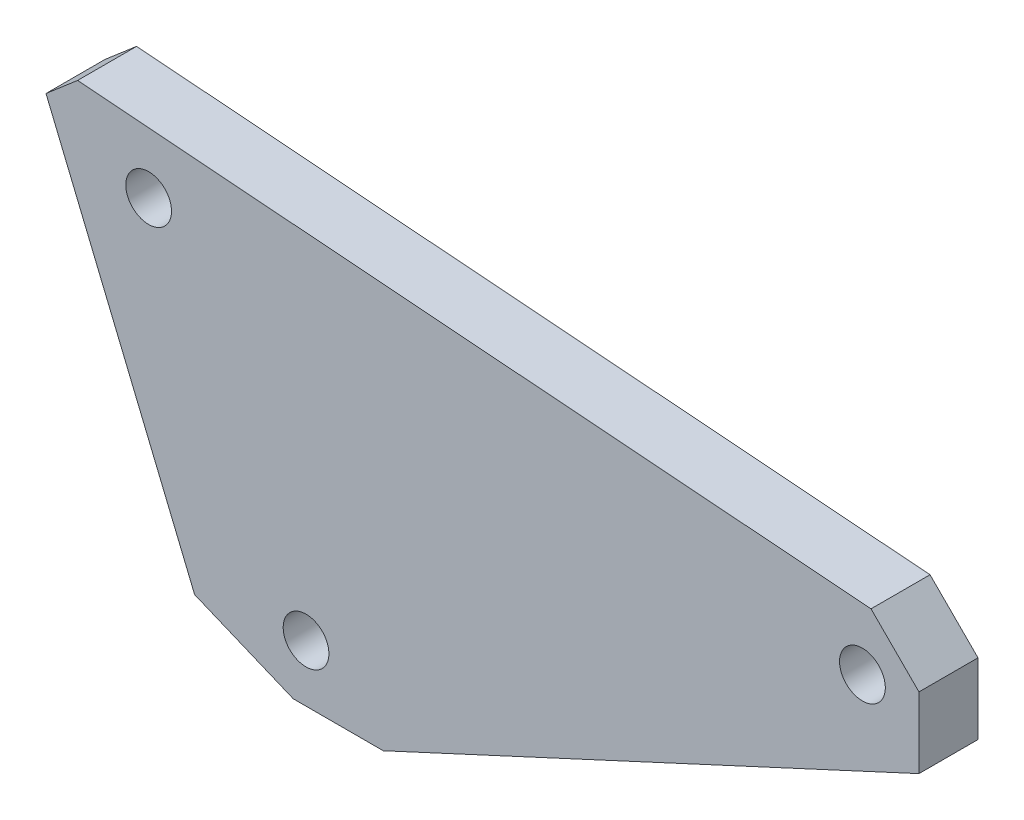
ISO-10303-21;
HEADER;
FILE_DESCRIPTION(('STEP AP214'),'2;1');
FILE_NAME('part.step','',(''),(''),'','','');
FILE_SCHEMA(('AUTOMOTIVE_DESIGN { 1 0 10303 214 1 1 1 1 }'));
ENDSEC;
DATA;
#1=APPLICATION_CONTEXT('core data for automotive mechanical design processes');
#2=APPLICATION_PROTOCOL_DEFINITION('international standard','automotive_design',2000,#1);
#3=PRODUCT_CONTEXT('',#1,'mechanical');
#4=PRODUCT('Part','Part','',(#3));
#5=PRODUCT_RELATED_PRODUCT_CATEGORY('part','',(#4));
#6=PRODUCT_DEFINITION_FORMATION('','',#4);
#7=PRODUCT_DEFINITION_CONTEXT('part definition',#1,'design');
#8=PRODUCT_DEFINITION('design','',#6,#7);
#9=PRODUCT_DEFINITION_SHAPE('','',#8);
#10=(LENGTH_UNIT() NAMED_UNIT(*) SI_UNIT(.MILLI.,.METRE.));
#11=(NAMED_UNIT(*) PLANE_ANGLE_UNIT() SI_UNIT($,.RADIAN.));
#12=(NAMED_UNIT(*) SI_UNIT($,.STERADIAN.) SOLID_ANGLE_UNIT());
#13=UNCERTAINTY_MEASURE_WITH_UNIT(LENGTH_MEASURE(1.E-05),#10,'distance_accuracy_value','');
#14=(GEOMETRIC_REPRESENTATION_CONTEXT(3) GLOBAL_UNCERTAINTY_ASSIGNED_CONTEXT((#13)) GLOBAL_UNIT_ASSIGNED_CONTEXT((#10,
#11,#12)) REPRESENTATION_CONTEXT('',''));
#15=CARTESIAN_POINT('',(0.,0.,0.));
#16=DIRECTION('',(0.,0.,1.));
#17=DIRECTION('',(1.,0.,0.));
#18=AXIS2_PLACEMENT_3D('',#15,#16,#17);
#19=CARTESIAN_POINT('',(40.3052811592435,9.5225496968505,4.));
#20=DIRECTION('',(-0.0764865575089781,-0.997070612604958,0.));
#21=DIRECTION('',(0.997070612604958,-0.0764865575089781,0.));
#22=AXIS2_PLACEMENT_3D('',#19,#20,#21);
#23=PLANE('',#22);
#24=DIRECTION('',(-0.997070612604958,0.0764865575089781,0.));
#25=VECTOR('',#24,1.);
#26=CARTESIAN_POINT('',(40.3052811592435,9.5225496968505,4.));
#27=LINE('',#26,#25);
#28=CARTESIAN_POINT('',(37.0560267090314,9.77180414706256,4.));
#29=VERTEX_POINT('',#28);
#30=CARTESIAN_POINT('',(-16.7035070029416,13.8957664973057,4.));
#31=VERTEX_POINT('',#30);
#32=EDGE_CURVE('E143',#29,#31,#27,.T.);
#33=ORIENTED_EDGE('',*,*,#32,.F.);
#34=DIRECTION('',(0.,0.,-1.));
#35=VECTOR('',#34,1.);
#36=CARTESIAN_POINT('',(37.0560267090314,9.77180414706256,4.));
#37=LINE('',#36,#35);
#38=CARTESIAN_POINT('',(37.0560267090314,9.77180414706256,0.));
#39=VERTEX_POINT('',#38);
#40=EDGE_CURVE('E43',#29,#39,#37,.T.);
#41=ORIENTED_EDGE('',*,*,#40,.T.);
#42=DIRECTION('',(-0.997070612604958,0.0764865575089781,0.));
#43=VECTOR('',#42,1.);
#44=CARTESIAN_POINT('',(40.3052811592435,9.5225496968505,0.));
#45=LINE('',#44,#43);
#46=CARTESIAN_POINT('',(-16.7035070029416,13.8957664973057,0.));
#47=VERTEX_POINT('',#46);
#48=EDGE_CURVE('E132',#39,#47,#45,.T.);
#49=ORIENTED_EDGE('',*,*,#48,.T.);
#50=DIRECTION('',(0.,0.,1.));
#51=VECTOR('',#50,1.);
#52=CARTESIAN_POINT('',(-16.7035070029416,13.8957664973057,4.));
#53=LINE('',#52,#51);
#54=EDGE_CURVE('E56',#47,#31,#53,.T.);
#55=ORIENTED_EDGE('',*,*,#54,.T.);
#56=EDGE_LOOP('',(#33,#41,#49,#55));
#57=FACE_BOUND('',#56,.T.);
#58=ADVANCED_FACE('F34',(#57),#23,.F.);
#59=CARTESIAN_POINT('',(-19.6947188407565,14.1252261698326,4.));
#60=DIRECTION('',(0.924192585062523,0.381926780568542,0.));
#61=DIRECTION('',(-0.381926780568541,0.924192585062523,0.));
#62=AXIS2_PLACEMENT_3D('',#59,#60,#61);
#63=PLANE('',#62);
#64=DIRECTION('',(0.381926780568542,-0.924192585062523,0.));
#65=VECTOR('',#64,1.);
#66=CARTESIAN_POINT('',(-19.6947188407565,14.1252261698326,0.));
#67=LINE('',#66,#65);
#68=CARTESIAN_POINT('',(-18.8420573324222,12.0619420963834,0.));
#69=VERTEX_POINT('',#68);
#70=CARTESIAN_POINT('',(-8.77118291816496,-12.3077222798545,0.));
#71=VERTEX_POINT('',#70);
#72=EDGE_CURVE('E134',#69,#71,#67,.T.);
#73=ORIENTED_EDGE('',*,*,#72,.T.);
#74=DIRECTION('',(0.,0.,1.));
#75=VECTOR('',#74,1.);
#76=CARTESIAN_POINT('',(-8.77118291816496,-12.3077222798545,4.));
#77=LINE('',#76,#75);
#78=CARTESIAN_POINT('',(-8.77118291816496,-12.3077222798545,4.));
#79=VERTEX_POINT('',#78);
#80=EDGE_CURVE('E166',#71,#79,#77,.T.);
#81=ORIENTED_EDGE('',*,*,#80,.T.);
#82=DIRECTION('',(0.381926780568542,-0.924192585062523,0.));
#83=VECTOR('',#82,1.);
#84=CARTESIAN_POINT('',(-19.6947188407565,14.1252261698326,4.));
#85=LINE('',#84,#83);
#86=CARTESIAN_POINT('',(-18.8420573324222,12.0619420963834,4.));
#87=VERTEX_POINT('',#86);
#88=EDGE_CURVE('E113',#87,#79,#85,.T.);
#89=ORIENTED_EDGE('',*,*,#88,.F.);
#90=DIRECTION('',(0.,0.,-1.));
#91=VECTOR('',#90,1.);
#92=CARTESIAN_POINT('',(-18.8420573324222,12.0619420963834,4.));
#93=LINE('',#92,#91);
#94=EDGE_CURVE('E163',#87,#69,#93,.T.);
#95=ORIENTED_EDGE('',*,*,#94,.T.);
#96=EDGE_LOOP('',(#73,#81,#89,#95));
#97=FACE_BOUND('',#96,.T.);
#98=ADVANCED_FACE('F187',(#97),#63,.F.);
#99=CARTESIAN_POINT('',(-7.62540257645933,-15.0803000350421,4.));
#100=DIRECTION('',(0.,1.,0.));
#101=DIRECTION('',(0.,0.,1.));
#102=AXIS2_PLACEMENT_3D('',#99,#100,#101);
#103=PLANE('',#102);
#104=DIRECTION('',(1.,0.,0.));
#105=VECTOR('',#104,1.);
#106=CARTESIAN_POINT('',(-7.62540257645933,-15.0803000350421,4.));
#107=LINE('',#106,#105);
#108=CARTESIAN_POINT('',(-2.09306036506088,-15.0803000350421,4.));
#109=VERTEX_POINT('',#108);
#110=CARTESIAN_POINT('',(4.00730701361784,-15.0803000350421,4.));
#111=VERTEX_POINT('',#110);
#112=EDGE_CURVE('E101',#109,#111,#107,.T.);
#113=ORIENTED_EDGE('',*,*,#112,.F.);
#114=DIRECTION('',(0.,0.,-1.));
#115=VECTOR('',#114,1.);
#116=CARTESIAN_POINT('',(-2.09306036506088,-15.0803000350421,4.));
#117=LINE('',#116,#115);
#118=CARTESIAN_POINT('',(-2.09306036506088,-15.0803000350421,0.));
#119=VERTEX_POINT('',#118);
#120=EDGE_CURVE('E122',#109,#119,#117,.T.);
#121=ORIENTED_EDGE('',*,*,#120,.T.);
#122=DIRECTION('',(1.,0.,0.));
#123=VECTOR('',#122,1.);
#124=CARTESIAN_POINT('',(-7.62540257645933,-15.0803000350421,0.));
#125=LINE('',#124,#123);
#126=CARTESIAN_POINT('',(4.00730701361784,-15.0803000350421,0.));
#127=VERTEX_POINT('',#126);
#128=EDGE_CURVE('E119',#119,#127,#125,.T.);
#129=ORIENTED_EDGE('',*,*,#128,.T.);
#130=DIRECTION('',(0.,0.,-1.));
#131=VECTOR('',#130,1.);
#132=CARTESIAN_POINT('',(4.00730701361784,-15.0803000350421,4.));
#133=LINE('',#132,#131);
#134=EDGE_CURVE('E116',#111,#127,#133,.T.);
#135=ORIENTED_EDGE('',*,*,#134,.F.);
#136=EDGE_LOOP('',(#113,#121,#129,#135));
#137=FACE_BOUND('',#136,.T.);
#138=ADVANCED_FACE('F117',(#137),#103,.F.);
#139=CARTESIAN_POINT('',(4.00730701361784,-15.0803000350421,4.));
#140=DIRECTION('',(-0.42016148154868,0.907449353640641,0.));
#141=DIRECTION('',(-0.907449353640641,-0.42016148154868,0.));
#142=AXIS2_PLACEMENT_3D('',#139,#140,#141);
#143=PLANE('',#142);
#144=DIRECTION('',(0.907449353640641,0.42016148154868,0.));
#145=VECTOR('',#144,1.);
#146=CARTESIAN_POINT('',(4.00730701361784,-15.0803000350421,0.));
#147=LINE('',#146,#145);
#148=CARTESIAN_POINT('',(40.3052811592435,1.72615922690515,0.));
#149=VERTEX_POINT('',#148);
#150=EDGE_CURVE('E139',#127,#149,#147,.T.);
#151=ORIENTED_EDGE('',*,*,#150,.T.);
#152=DIRECTION('',(0.,0.,-1.));
#153=VECTOR('',#152,1.);
#154=CARTESIAN_POINT('',(40.3052811592435,1.72615922690515,4.));
#155=LINE('',#154,#153);
#156=CARTESIAN_POINT('',(40.3052811592435,1.72615922690515,4.));
#157=VERTEX_POINT('',#156);
#158=EDGE_CURVE('E123',#157,#149,#155,.T.);
#159=ORIENTED_EDGE('',*,*,#158,.F.);
#160=DIRECTION('',(0.907449353640641,0.42016148154868,0.));
#161=VECTOR('',#160,1.);
#162=CARTESIAN_POINT('',(4.00730701361784,-15.0803000350421,4.));
#163=LINE('',#162,#161);
#164=EDGE_CURVE('E106',#111,#157,#163,.T.);
#165=ORIENTED_EDGE('',*,*,#164,.F.);
#166=ORIENTED_EDGE('',*,*,#134,.T.);
#167=EDGE_LOOP('',(#151,#159,#165,#166));
#168=FACE_BOUND('',#167,.T.);
#169=ADVANCED_FACE('F125',(#168),#143,.F.);
#170=CARTESIAN_POINT('',(40.3052811592435,1.72615922690515,4.));
#171=DIRECTION('',(-1.,0.,0.));
#172=DIRECTION('',(0.,0.,1.));
#173=AXIS2_PLACEMENT_3D('',#170,#171,#172);
#174=PLANE('',#173);
#175=DIRECTION('',(0.,1.,0.));
#176=VECTOR('',#175,1.);
#177=CARTESIAN_POINT('',(40.3052811592435,1.72615922690515,0.));
#178=LINE('',#177,#176);
#179=CARTESIAN_POINT('',(40.3052811592435,6.52254969685048,0.));
#180=VERTEX_POINT('',#179);
#181=EDGE_CURVE('E141',#149,#180,#178,.T.);
#182=ORIENTED_EDGE('',*,*,#181,.T.);
#183=DIRECTION('',(0.,0.,1.));
#184=VECTOR('',#183,1.);
#185=CARTESIAN_POINT('',(40.3052811592435,6.52254969685048,4.));
#186=LINE('',#185,#184);
#187=CARTESIAN_POINT('',(40.3052811592435,6.52254969685048,4.));
#188=VERTEX_POINT('',#187);
#189=EDGE_CURVE('E11',#180,#188,#186,.T.);
#190=ORIENTED_EDGE('',*,*,#189,.T.);
#191=DIRECTION('',(0.,1.,0.));
#192=VECTOR('',#191,1.);
#193=CARTESIAN_POINT('',(40.3052811592435,1.72615922690515,4.));
#194=LINE('',#193,#192);
#195=EDGE_CURVE('E127',#157,#188,#194,.T.);
#196=ORIENTED_EDGE('',*,*,#195,.F.);
#197=ORIENTED_EDGE('',*,*,#158,.T.);
#198=EDGE_LOOP('',(#182,#190,#196,#197));
#199=FACE_BOUND('',#198,.T.);
#200=ADVANCED_FACE('F201',(#199),#174,.F.);
#201=CARTESIAN_POINT('',(0.,0.,4.));
#202=DIRECTION('',(0.,0.,-1.));
#203=DIRECTION('',(-1.,0.,0.));
#204=AXIS2_PLACEMENT_3D('',#201,#202,#203);
#205=PLANE('',#204);
#206=CARTESIAN_POINT('',(-11.8877500790562,9.40291745557331,4.));
#207=DIRECTION('',(0.,0.,-1.));
#208=DIRECTION('',(-1.,0.,0.));
#209=AXIS2_PLACEMENT_3D('',#206,#207,#208);
#210=CIRCLE('',#209,1.55);
#211=CARTESIAN_POINT('',(-13.4377500790562,9.40291745557331,4.));
#212=VERTEX_POINT('',#211);
#213=EDGE_CURVE('E135',#212,#212,#210,.F.);
#214=ORIENTED_EDGE('',*,*,#213,.F.);
#215=EDGE_LOOP('',(#214));
#216=FACE_BOUND('',#215,.T.);
#217=CARTESIAN_POINT('',(-1.22267549855487,-11.2287016488662,4.));
#218=DIRECTION('',(0.,0.,-1.));
#219=DIRECTION('',(-1.,0.,0.));
#220=AXIS2_PLACEMENT_3D('',#217,#218,#219);
#221=CIRCLE('',#220,1.55);
#222=CARTESIAN_POINT('',(-2.77267549855487,-11.2287016488662,4.));
#223=VERTEX_POINT('',#222);
#224=EDGE_CURVE('E152',#223,#223,#221,.F.);
#225=ORIENTED_EDGE('',*,*,#224,.F.);
#226=EDGE_LOOP('',(#225));
#227=FACE_BOUND('',#226,.T.);
#228=CARTESIAN_POINT('',(36.4749180601786,5.62435446187783,4.));
#229=DIRECTION('',(0.,0.,-1.));
#230=DIRECTION('',(-1.,0.,0.));
#231=AXIS2_PLACEMENT_3D('',#228,#229,#230);
#232=CIRCLE('',#231,1.55);
#233=CARTESIAN_POINT('',(34.9249180601785,5.62435446187783,4.));
#234=VERTEX_POINT('',#233);
#235=EDGE_CURVE('E148',#234,#234,#232,.F.);
#236=ORIENTED_EDGE('',*,*,#235,.F.);
#237=EDGE_LOOP('',(#236));
#238=FACE_BOUND('',#237,.T.);
#239=ORIENTED_EDGE('',*,*,#88,.T.);
#240=DIRECTION('',(-0.923565860476797,0.383439827563275,0.));
#241=VECTOR('',#240,1.);
#242=CARTESIAN_POINT('',(-2.09306036506088,-15.0803000350421,4.));
#243=LINE('',#242,#241);
#244=EDGE_CURVE('E109',#79,#109,#243,.F.);
#245=ORIENTED_EDGE('',*,*,#244,.T.);
#246=ORIENTED_EDGE('',*,*,#112,.T.);
#247=ORIENTED_EDGE('',*,*,#164,.T.);
#248=ORIENTED_EDGE('',*,*,#195,.T.);
#249=DIRECTION('',(0.707106781186545,-0.70710678118655,0.));
#250=VECTOR('',#249,1.);
#251=CARTESIAN_POINT('',(37.0560267090314,9.77180414706256,4.));
#252=LINE('',#251,#250);
#253=EDGE_CURVE('E170',#188,#29,#252,.F.);
#254=ORIENTED_EDGE('',*,*,#253,.T.);
#255=ORIENTED_EDGE('',*,*,#32,.T.);
#256=DIRECTION('',(0.759119554979005,0.650951228010576,0.));
#257=VECTOR('',#256,1.);
#258=CARTESIAN_POINT('',(-18.8420573324222,12.0619420963834,4.));
#259=LINE('',#258,#257);
#260=EDGE_CURVE('E168',#31,#87,#259,.F.);
#261=ORIENTED_EDGE('',*,*,#260,.T.);
#262=EDGE_LOOP('',(#239,#245,#246,#247,#248,#254,#255,#261));
#263=FACE_BOUND('',#262,.T.);
#264=ADVANCED_FACE('F104',(#216,#227,#238,#263),#205,.F.);
#265=CARTESIAN_POINT('',(0.,0.,0.));
#266=DIRECTION('',(0.,0.,-1.));
#267=DIRECTION('',(-1.,0.,0.));
#268=AXIS2_PLACEMENT_3D('',#265,#266,#267);
#269=PLANE('',#268);
#270=CARTESIAN_POINT('',(-11.8877500790562,9.40291745557331,0.));
#271=DIRECTION('',(0.,0.,-1.));
#272=DIRECTION('',(-1.,0.,0.));
#273=AXIS2_PLACEMENT_3D('',#270,#271,#272);
#274=CIRCLE('',#273,1.55);
#275=CARTESIAN_POINT('',(-13.4377500790562,9.40291745557331,0.));
#276=VERTEX_POINT('',#275);
#277=EDGE_CURVE('E153',#276,#276,#274,.F.);
#278=ORIENTED_EDGE('',*,*,#277,.T.);
#279=EDGE_LOOP('',(#278));
#280=FACE_BOUND('',#279,.T.);
#281=CARTESIAN_POINT('',(-1.22267549855487,-11.2287016488662,0.));
#282=DIRECTION('',(0.,0.,-1.));
#283=DIRECTION('',(-1.,0.,0.));
#284=AXIS2_PLACEMENT_3D('',#281,#282,#283);
#285=CIRCLE('',#284,1.55);
#286=CARTESIAN_POINT('',(-2.77267549855487,-11.2287016488662,0.));
#287=VERTEX_POINT('',#286);
#288=EDGE_CURVE('E149',#287,#287,#285,.F.);
#289=ORIENTED_EDGE('',*,*,#288,.T.);
#290=EDGE_LOOP('',(#289));
#291=FACE_BOUND('',#290,.T.);
#292=CARTESIAN_POINT('',(36.4749180601786,5.62435446187783,0.));
#293=DIRECTION('',(0.,0.,-1.));
#294=DIRECTION('',(-1.,0.,0.));
#295=AXIS2_PLACEMENT_3D('',#292,#293,#294);
#296=CIRCLE('',#295,1.55);
#297=CARTESIAN_POINT('',(34.9249180601785,5.62435446187783,0.));
#298=VERTEX_POINT('',#297);
#299=EDGE_CURVE('E145',#298,#298,#296,.F.);
#300=ORIENTED_EDGE('',*,*,#299,.T.);
#301=EDGE_LOOP('',(#300));
#302=FACE_BOUND('',#301,.T.);
#303=ORIENTED_EDGE('',*,*,#128,.F.);
#304=DIRECTION('',(0.923565860476797,-0.383439827563275,0.));
#305=VECTOR('',#304,1.);
#306=CARTESIAN_POINT('',(-5.64815032639054,-13.6043218291776,0.));
#307=LINE('',#306,#305);
#308=EDGE_CURVE('E161',#119,#71,#307,.F.);
#309=ORIENTED_EDGE('',*,*,#308,.T.);
#310=ORIENTED_EDGE('',*,*,#72,.F.);
#311=DIRECTION('',(-0.759119554979005,-0.650951228010576,0.));
#312=VECTOR('',#311,1.);
#313=CARTESIAN_POINT('',(-13.9444926456095,16.2616438775212,0.));
#314=LINE('',#313,#312);
#315=EDGE_CURVE('E157',#69,#47,#314,.F.);
#316=ORIENTED_EDGE('',*,*,#315,.T.);
#317=ORIENTED_EDGE('',*,*,#48,.F.);
#318=DIRECTION('',(-0.707106781186545,0.70710678118655,0.));
#319=VECTOR('',#318,1.);
#320=CARTESIAN_POINT('',(23.4139154280471,23.413915428047,0.));
#321=LINE('',#320,#319);
#322=EDGE_CURVE('E159',#39,#180,#321,.F.);
#323=ORIENTED_EDGE('',*,*,#322,.T.);
#324=ORIENTED_EDGE('',*,*,#181,.F.);
#325=ORIENTED_EDGE('',*,*,#150,.F.);
#326=EDGE_LOOP('',(#303,#309,#310,#316,#317,#323,#324,#325));
#327=FACE_BOUND('',#326,.T.);
#328=ADVANCED_FACE('F179',(#280,#291,#302,#327),#269,.T.);
#329=CARTESIAN_POINT('',(36.4749180601786,5.62435446187783,8.));
#330=DIRECTION('',(0.,0.,-1.));
#331=DIRECTION('',(-1.,0.,0.));
#332=AXIS2_PLACEMENT_3D('',#329,#330,#331);
#333=CYLINDRICAL_SURFACE('',#332,1.55);
#334=CARTESIAN_POINT('',(34.9249180601785,5.62435446187783,0.));
#335=CARTESIAN_POINT('',(34.9249180601785,5.62435446187783,0.0416666666666667));
#336=CARTESIAN_POINT('',(34.9249180601785,5.62435446187783,0.0833333333333334));
#337=CARTESIAN_POINT('',(34.9249180601785,5.62435446187783,0.166666666666667));
#338=CARTESIAN_POINT('',(34.9249180601785,5.62435446187783,0.208333333333334));
#339=CARTESIAN_POINT('',(34.9249180601785,5.62435446187783,0.291666666666667));
#340=CARTESIAN_POINT('',(34.9249180601785,5.62435446187783,0.333333333333334));
#341=CARTESIAN_POINT('',(34.9249180601785,5.62435446187783,0.416666666666667));
#342=CARTESIAN_POINT('',(34.9249180601785,5.62435446187783,0.458333333333334));
#343=CARTESIAN_POINT('',(34.9249180601785,5.62435446187783,0.541666666666667));
#344=CARTESIAN_POINT('',(34.9249180601785,5.62435446187783,0.583333333333333));
#345=CARTESIAN_POINT('',(34.9249180601785,5.62435446187783,0.666666666666666));
#346=CARTESIAN_POINT('',(34.9249180601785,5.62435446187783,0.708333333333333));
#347=CARTESIAN_POINT('',(34.9249180601785,5.62435446187783,0.791666666666667));
#348=CARTESIAN_POINT('',(34.9249180601785,5.62435446187783,0.833333333333333));
#349=CARTESIAN_POINT('',(34.9249180601785,5.62435446187783,0.916666666666667));
#350=CARTESIAN_POINT('',(34.9249180601785,5.62435446187783,0.958333333333333));
#351=CARTESIAN_POINT('',(34.9249180601785,5.62435446187783,1.04166666666667));
#352=CARTESIAN_POINT('',(34.9249180601785,5.62435446187783,1.08333333333333));
#353=CARTESIAN_POINT('',(34.9249180601785,5.62435446187783,1.16666666666667));
#354=CARTESIAN_POINT('',(34.9249180601785,5.62435446187783,1.20833333333333));
#355=CARTESIAN_POINT('',(34.9249180601785,5.62435446187783,1.29166666666667));
#356=CARTESIAN_POINT('',(34.9249180601785,5.62435446187783,1.33333333333333));
#357=CARTESIAN_POINT('',(34.9249180601785,5.62435446187783,1.41666666666667));
#358=CARTESIAN_POINT('',(34.9249180601785,5.62435446187783,1.45833333333333));
#359=CARTESIAN_POINT('',(34.9249180601785,5.62435446187783,1.54166666666667));
#360=CARTESIAN_POINT('',(34.9249180601785,5.62435446187783,1.58333333333333));
#361=CARTESIAN_POINT('',(34.9249180601785,5.62435446187783,1.66666666666667));
#362=CARTESIAN_POINT('',(34.9249180601785,5.62435446187783,1.70833333333333));
#363=CARTESIAN_POINT('',(34.9249180601785,5.62435446187783,1.79166666666667));
#364=CARTESIAN_POINT('',(34.9249180601785,5.62435446187783,1.83333333333333));
#365=CARTESIAN_POINT('',(34.9249180601785,5.62435446187783,1.91666666666667));
#366=CARTESIAN_POINT('',(34.9249180601785,5.62435446187783,1.95833333333333));
#367=CARTESIAN_POINT('',(34.9249180601785,5.62435446187783,2.04166666666667));
#368=CARTESIAN_POINT('',(34.9249180601785,5.62435446187783,2.08333333333333));
#369=CARTESIAN_POINT('',(34.9249180601785,5.62435446187783,2.16666666666667));
#370=CARTESIAN_POINT('',(34.9249180601785,5.62435446187783,2.20833333333333));
#371=CARTESIAN_POINT('',(34.9249180601785,5.62435446187783,2.29166666666667));
#372=CARTESIAN_POINT('',(34.9249180601785,5.62435446187783,2.33333333333333));
#373=CARTESIAN_POINT('',(34.9249180601785,5.62435446187783,2.41666666666667));
#374=CARTESIAN_POINT('',(34.9249180601785,5.62435446187783,2.45833333333333));
#375=CARTESIAN_POINT('',(34.9249180601785,5.62435446187783,2.54166666666667));
#376=CARTESIAN_POINT('',(34.9249180601785,5.62435446187783,2.58333333333333));
#377=CARTESIAN_POINT('',(34.9249180601785,5.62435446187783,2.66666666666667));
#378=CARTESIAN_POINT('',(34.9249180601785,5.62435446187783,2.70833333333333));
#379=CARTESIAN_POINT('',(34.9249180601785,5.62435446187783,2.79166666666667));
#380=CARTESIAN_POINT('',(34.9249180601785,5.62435446187783,2.83333333333333));
#381=CARTESIAN_POINT('',(34.9249180601785,5.62435446187783,2.91666666666667));
#382=CARTESIAN_POINT('',(34.9249180601785,5.62435446187783,2.95833333333333));
#383=CARTESIAN_POINT('',(34.9249180601785,5.62435446187783,3.04166666666667));
#384=CARTESIAN_POINT('',(34.9249180601785,5.62435446187783,3.08333333333333));
#385=CARTESIAN_POINT('',(34.9249180601785,5.62435446187783,3.16666666666667));
#386=CARTESIAN_POINT('',(34.9249180601785,5.62435446187783,3.20833333333333));
#387=CARTESIAN_POINT('',(34.9249180601785,5.62435446187783,3.29166666666667));
#388=CARTESIAN_POINT('',(34.9249180601785,5.62435446187783,3.33333333333333));
#389=CARTESIAN_POINT('',(34.9249180601785,5.62435446187783,3.41666666666667));
#390=CARTESIAN_POINT('',(34.9249180601785,5.62435446187783,3.45833333333333));
#391=CARTESIAN_POINT('',(34.9249180601785,5.62435446187783,3.54166666666667));
#392=CARTESIAN_POINT('',(34.9249180601785,5.62435446187783,3.58333333333333));
#393=CARTESIAN_POINT('',(34.9249180601785,5.62435446187783,3.66666666666667));
#394=CARTESIAN_POINT('',(34.9249180601785,5.62435446187783,3.70833333333333));
#395=CARTESIAN_POINT('',(34.9249180601785,5.62435446187783,3.79166666666667));
#396=CARTESIAN_POINT('',(34.9249180601785,5.62435446187783,3.83333333333333));
#397=CARTESIAN_POINT('',(34.9249180601785,5.62435446187783,3.91666666666667));
#398=CARTESIAN_POINT('',(34.9249180601785,5.62435446187783,3.95833333333333));
#399=CARTESIAN_POINT('',(34.9249180601785,5.62435446187783,4.));
#400=B_SPLINE_CURVE_WITH_KNOTS('',3,(#334,#335,#336,#337,#338,#339,#340,#341,#342,#343,#344,
#345,#346,#347,#348,#349,#350,#351,#352,#353,#354,#355,#356,#357,#358,#359,#360,#361,#362,#363,
#364,#365,#366,#367,#368,#369,#370,#371,#372,#373,#374,#375,#376,#377,#378,#379,#380,#381,#382,
#383,#384,#385,#386,#387,#388,#389,#390,#391,#392,#393,#394,#395,#396,#397,#398,#399),
.UNSPECIFIED.,.F.,.F.,(4,2,2,2,2,2,2,2,2,2,2,2,2,2,2,2,2,2,2,2,2,2,2,2,2,2,2,2,2,2,2,2,4),(0.,
0.125,0.25,0.375,0.5,0.625,0.75,0.875,1.,1.125,1.25,1.375,1.5,1.625,1.75,1.875,2.,2.125,2.25,
2.375,2.5,2.625,2.75,2.875,3.,3.125,3.25,3.375,3.5,3.625,3.75,3.875,4.),.UNSPECIFIED.);
#401=EDGE_CURVE('BSEAM198',#298,#234,#400,.T.);
#402=ORIENTED_EDGE('',*,*,#299,.F.);
#403=ORIENTED_EDGE('',*,*,#235,.T.);
#404=ORIENTED_EDGE('',*,*,#401,.T.);
#405=ORIENTED_EDGE('',*,*,#401,.F.);
#406=EDGE_LOOP('',(#402,#404,#403,#405));
#407=FACE_BOUND('',#406,.T.);
#408=ADVANCED_FACE('F198',(#407),#333,.F.);
#409=CARTESIAN_POINT('',(-1.22267549855487,-11.2287016488662,8.));
#410=DIRECTION('',(0.,0.,-1.));
#411=DIRECTION('',(-1.,0.,0.));
#412=AXIS2_PLACEMENT_3D('',#409,#410,#411);
#413=CYLINDRICAL_SURFACE('',#412,1.55);
#414=CARTESIAN_POINT('',(-2.77267549855487,-11.2287016488662,0.));
#415=CARTESIAN_POINT('',(-2.77267549855487,-11.2287016488662,0.0416666666666667));
#416=CARTESIAN_POINT('',(-2.77267549855487,-11.2287016488662,0.0833333333333334));
#417=CARTESIAN_POINT('',(-2.77267549855487,-11.2287016488662,0.166666666666667));
#418=CARTESIAN_POINT('',(-2.77267549855487,-11.2287016488662,0.208333333333334));
#419=CARTESIAN_POINT('',(-2.77267549855487,-11.2287016488662,0.291666666666667));
#420=CARTESIAN_POINT('',(-2.77267549855487,-11.2287016488662,0.333333333333334));
#421=CARTESIAN_POINT('',(-2.77267549855487,-11.2287016488662,0.416666666666667));
#422=CARTESIAN_POINT('',(-2.77267549855487,-11.2287016488662,0.458333333333334));
#423=CARTESIAN_POINT('',(-2.77267549855487,-11.2287016488662,0.541666666666667));
#424=CARTESIAN_POINT('',(-2.77267549855487,-11.2287016488662,0.583333333333333));
#425=CARTESIAN_POINT('',(-2.77267549855487,-11.2287016488662,0.666666666666666));
#426=CARTESIAN_POINT('',(-2.77267549855487,-11.2287016488662,0.708333333333333));
#427=CARTESIAN_POINT('',(-2.77267549855487,-11.2287016488662,0.791666666666667));
#428=CARTESIAN_POINT('',(-2.77267549855487,-11.2287016488662,0.833333333333333));
#429=CARTESIAN_POINT('',(-2.77267549855487,-11.2287016488662,0.916666666666667));
#430=CARTESIAN_POINT('',(-2.77267549855487,-11.2287016488662,0.958333333333333));
#431=CARTESIAN_POINT('',(-2.77267549855487,-11.2287016488662,1.04166666666667));
#432=CARTESIAN_POINT('',(-2.77267549855487,-11.2287016488662,1.08333333333333));
#433=CARTESIAN_POINT('',(-2.77267549855487,-11.2287016488662,1.16666666666667));
#434=CARTESIAN_POINT('',(-2.77267549855487,-11.2287016488662,1.20833333333333));
#435=CARTESIAN_POINT('',(-2.77267549855487,-11.2287016488662,1.29166666666667));
#436=CARTESIAN_POINT('',(-2.77267549855487,-11.2287016488662,1.33333333333333));
#437=CARTESIAN_POINT('',(-2.77267549855487,-11.2287016488662,1.41666666666667));
#438=CARTESIAN_POINT('',(-2.77267549855487,-11.2287016488662,1.45833333333333));
#439=CARTESIAN_POINT('',(-2.77267549855487,-11.2287016488662,1.54166666666667));
#440=CARTESIAN_POINT('',(-2.77267549855487,-11.2287016488662,1.58333333333333));
#441=CARTESIAN_POINT('',(-2.77267549855487,-11.2287016488662,1.66666666666667));
#442=CARTESIAN_POINT('',(-2.77267549855487,-11.2287016488662,1.70833333333333));
#443=CARTESIAN_POINT('',(-2.77267549855487,-11.2287016488662,1.79166666666667));
#444=CARTESIAN_POINT('',(-2.77267549855487,-11.2287016488662,1.83333333333333));
#445=CARTESIAN_POINT('',(-2.77267549855487,-11.2287016488662,1.91666666666667));
#446=CARTESIAN_POINT('',(-2.77267549855487,-11.2287016488662,1.95833333333333));
#447=CARTESIAN_POINT('',(-2.77267549855487,-11.2287016488662,2.04166666666667));
#448=CARTESIAN_POINT('',(-2.77267549855487,-11.2287016488662,2.08333333333333));
#449=CARTESIAN_POINT('',(-2.77267549855487,-11.2287016488662,2.16666666666667));
#450=CARTESIAN_POINT('',(-2.77267549855487,-11.2287016488662,2.20833333333333));
#451=CARTESIAN_POINT('',(-2.77267549855487,-11.2287016488662,2.29166666666667));
#452=CARTESIAN_POINT('',(-2.77267549855487,-11.2287016488662,2.33333333333333));
#453=CARTESIAN_POINT('',(-2.77267549855487,-11.2287016488662,2.41666666666667));
#454=CARTESIAN_POINT('',(-2.77267549855487,-11.2287016488662,2.45833333333333));
#455=CARTESIAN_POINT('',(-2.77267549855487,-11.2287016488662,2.54166666666667));
#456=CARTESIAN_POINT('',(-2.77267549855487,-11.2287016488662,2.58333333333333));
#457=CARTESIAN_POINT('',(-2.77267549855487,-11.2287016488662,2.66666666666667));
#458=CARTESIAN_POINT('',(-2.77267549855487,-11.2287016488662,2.70833333333333));
#459=CARTESIAN_POINT('',(-2.77267549855487,-11.2287016488662,2.79166666666667));
#460=CARTESIAN_POINT('',(-2.77267549855487,-11.2287016488662,2.83333333333333));
#461=CARTESIAN_POINT('',(-2.77267549855487,-11.2287016488662,2.91666666666667));
#462=CARTESIAN_POINT('',(-2.77267549855487,-11.2287016488662,2.95833333333333));
#463=CARTESIAN_POINT('',(-2.77267549855487,-11.2287016488662,3.04166666666667));
#464=CARTESIAN_POINT('',(-2.77267549855487,-11.2287016488662,3.08333333333333));
#465=CARTESIAN_POINT('',(-2.77267549855487,-11.2287016488662,3.16666666666667));
#466=CARTESIAN_POINT('',(-2.77267549855487,-11.2287016488662,3.20833333333333));
#467=CARTESIAN_POINT('',(-2.77267549855487,-11.2287016488662,3.29166666666667));
#468=CARTESIAN_POINT('',(-2.77267549855487,-11.2287016488662,3.33333333333333));
#469=CARTESIAN_POINT('',(-2.77267549855487,-11.2287016488662,3.41666666666667));
#470=CARTESIAN_POINT('',(-2.77267549855487,-11.2287016488662,3.45833333333333));
#471=CARTESIAN_POINT('',(-2.77267549855487,-11.2287016488662,3.54166666666667));
#472=CARTESIAN_POINT('',(-2.77267549855487,-11.2287016488662,3.58333333333333));
#473=CARTESIAN_POINT('',(-2.77267549855487,-11.2287016488662,3.66666666666667));
#474=CARTESIAN_POINT('',(-2.77267549855487,-11.2287016488662,3.70833333333333));
#475=CARTESIAN_POINT('',(-2.77267549855487,-11.2287016488662,3.79166666666667));
#476=CARTESIAN_POINT('',(-2.77267549855487,-11.2287016488662,3.83333333333333));
#477=CARTESIAN_POINT('',(-2.77267549855487,-11.2287016488662,3.91666666666667));
#478=CARTESIAN_POINT('',(-2.77267549855487,-11.2287016488662,3.95833333333333));
#479=CARTESIAN_POINT('',(-2.77267549855487,-11.2287016488662,4.));
#480=B_SPLINE_CURVE_WITH_KNOTS('',3,(#414,#415,#416,#417,#418,#419,#420,#421,#422,#423,#424,
#425,#426,#427,#428,#429,#430,#431,#432,#433,#434,#435,#436,#437,#438,#439,#440,#441,#442,#443,
#444,#445,#446,#447,#448,#449,#450,#451,#452,#453,#454,#455,#456,#457,#458,#459,#460,#461,#462,
#463,#464,#465,#466,#467,#468,#469,#470,#471,#472,#473,#474,#475,#476,#477,#478,#479),
.UNSPECIFIED.,.F.,.F.,(4,2,2,2,2,2,2,2,2,2,2,2,2,2,2,2,2,2,2,2,2,2,2,2,2,2,2,2,2,2,2,2,4),(0.,
0.125,0.25,0.375,0.5,0.625,0.75,0.875,1.,1.125,1.25,1.375,1.5,1.625,1.75,1.875,2.,2.125,2.25,
2.375,2.5,2.625,2.75,2.875,3.,3.125,3.25,3.375,3.5,3.625,3.75,3.875,4.),.UNSPECIFIED.);
#481=EDGE_CURVE('BSEAM295',#287,#223,#480,.T.);
#482=ORIENTED_EDGE('',*,*,#288,.F.);
#483=ORIENTED_EDGE('',*,*,#224,.T.);
#484=ORIENTED_EDGE('',*,*,#481,.T.);
#485=ORIENTED_EDGE('',*,*,#481,.F.);
#486=EDGE_LOOP('',(#482,#484,#483,#485));
#487=FACE_BOUND('',#486,.T.);
#488=ADVANCED_FACE('F295',(#487),#413,.F.);
#489=CARTESIAN_POINT('',(-11.8877500790562,9.40291745557331,8.));
#490=DIRECTION('',(0.,0.,-1.));
#491=DIRECTION('',(-1.,0.,0.));
#492=AXIS2_PLACEMENT_3D('',#489,#490,#491);
#493=CYLINDRICAL_SURFACE('',#492,1.55);
#494=CARTESIAN_POINT('',(-13.4377500790562,9.40291745557331,0.));
#495=CARTESIAN_POINT('',(-13.4377500790562,9.40291745557331,0.0416666666666667));
#496=CARTESIAN_POINT('',(-13.4377500790562,9.40291745557331,0.0833333333333334));
#497=CARTESIAN_POINT('',(-13.4377500790562,9.40291745557331,0.166666666666667));
#498=CARTESIAN_POINT('',(-13.4377500790562,9.40291745557331,0.208333333333334));
#499=CARTESIAN_POINT('',(-13.4377500790562,9.40291745557331,0.291666666666667));
#500=CARTESIAN_POINT('',(-13.4377500790562,9.40291745557331,0.333333333333334));
#501=CARTESIAN_POINT('',(-13.4377500790562,9.40291745557331,0.416666666666667));
#502=CARTESIAN_POINT('',(-13.4377500790562,9.40291745557331,0.458333333333334));
#503=CARTESIAN_POINT('',(-13.4377500790562,9.40291745557331,0.541666666666667));
#504=CARTESIAN_POINT('',(-13.4377500790562,9.40291745557331,0.583333333333333));
#505=CARTESIAN_POINT('',(-13.4377500790562,9.40291745557331,0.666666666666666));
#506=CARTESIAN_POINT('',(-13.4377500790562,9.40291745557331,0.708333333333333));
#507=CARTESIAN_POINT('',(-13.4377500790562,9.40291745557331,0.791666666666667));
#508=CARTESIAN_POINT('',(-13.4377500790562,9.40291745557331,0.833333333333333));
#509=CARTESIAN_POINT('',(-13.4377500790562,9.40291745557331,0.916666666666667));
#510=CARTESIAN_POINT('',(-13.4377500790562,9.40291745557331,0.958333333333333));
#511=CARTESIAN_POINT('',(-13.4377500790562,9.40291745557331,1.04166666666667));
#512=CARTESIAN_POINT('',(-13.4377500790562,9.40291745557331,1.08333333333333));
#513=CARTESIAN_POINT('',(-13.4377500790562,9.40291745557331,1.16666666666667));
#514=CARTESIAN_POINT('',(-13.4377500790562,9.40291745557331,1.20833333333333));
#515=CARTESIAN_POINT('',(-13.4377500790562,9.40291745557331,1.29166666666667));
#516=CARTESIAN_POINT('',(-13.4377500790562,9.40291745557331,1.33333333333333));
#517=CARTESIAN_POINT('',(-13.4377500790562,9.40291745557331,1.41666666666667));
#518=CARTESIAN_POINT('',(-13.4377500790562,9.40291745557331,1.45833333333333));
#519=CARTESIAN_POINT('',(-13.4377500790562,9.40291745557331,1.54166666666667));
#520=CARTESIAN_POINT('',(-13.4377500790562,9.40291745557331,1.58333333333333));
#521=CARTESIAN_POINT('',(-13.4377500790562,9.40291745557331,1.66666666666667));
#522=CARTESIAN_POINT('',(-13.4377500790562,9.40291745557331,1.70833333333333));
#523=CARTESIAN_POINT('',(-13.4377500790562,9.40291745557331,1.79166666666667));
#524=CARTESIAN_POINT('',(-13.4377500790562,9.40291745557331,1.83333333333333));
#525=CARTESIAN_POINT('',(-13.4377500790562,9.40291745557331,1.91666666666667));
#526=CARTESIAN_POINT('',(-13.4377500790562,9.40291745557331,1.95833333333333));
#527=CARTESIAN_POINT('',(-13.4377500790562,9.40291745557331,2.04166666666667));
#528=CARTESIAN_POINT('',(-13.4377500790562,9.40291745557331,2.08333333333333));
#529=CARTESIAN_POINT('',(-13.4377500790562,9.40291745557331,2.16666666666667));
#530=CARTESIAN_POINT('',(-13.4377500790562,9.40291745557331,2.20833333333333));
#531=CARTESIAN_POINT('',(-13.4377500790562,9.40291745557331,2.29166666666667));
#532=CARTESIAN_POINT('',(-13.4377500790562,9.40291745557331,2.33333333333333));
#533=CARTESIAN_POINT('',(-13.4377500790562,9.40291745557331,2.41666666666667));
#534=CARTESIAN_POINT('',(-13.4377500790562,9.40291745557331,2.45833333333333));
#535=CARTESIAN_POINT('',(-13.4377500790562,9.40291745557331,2.54166666666667));
#536=CARTESIAN_POINT('',(-13.4377500790562,9.40291745557331,2.58333333333333));
#537=CARTESIAN_POINT('',(-13.4377500790562,9.40291745557331,2.66666666666667));
#538=CARTESIAN_POINT('',(-13.4377500790562,9.40291745557331,2.70833333333333));
#539=CARTESIAN_POINT('',(-13.4377500790562,9.40291745557331,2.79166666666667));
#540=CARTESIAN_POINT('',(-13.4377500790562,9.40291745557331,2.83333333333333));
#541=CARTESIAN_POINT('',(-13.4377500790562,9.40291745557331,2.91666666666667));
#542=CARTESIAN_POINT('',(-13.4377500790562,9.40291745557331,2.95833333333333));
#543=CARTESIAN_POINT('',(-13.4377500790562,9.40291745557331,3.04166666666667));
#544=CARTESIAN_POINT('',(-13.4377500790562,9.40291745557331,3.08333333333333));
#545=CARTESIAN_POINT('',(-13.4377500790562,9.40291745557331,3.16666666666667));
#546=CARTESIAN_POINT('',(-13.4377500790562,9.40291745557331,3.20833333333333));
#547=CARTESIAN_POINT('',(-13.4377500790562,9.40291745557331,3.29166666666667));
#548=CARTESIAN_POINT('',(-13.4377500790562,9.40291745557331,3.33333333333333));
#549=CARTESIAN_POINT('',(-13.4377500790562,9.40291745557331,3.41666666666667));
#550=CARTESIAN_POINT('',(-13.4377500790562,9.40291745557331,3.45833333333333));
#551=CARTESIAN_POINT('',(-13.4377500790562,9.40291745557331,3.54166666666667));
#552=CARTESIAN_POINT('',(-13.4377500790562,9.40291745557331,3.58333333333333));
#553=CARTESIAN_POINT('',(-13.4377500790562,9.40291745557331,3.66666666666667));
#554=CARTESIAN_POINT('',(-13.4377500790562,9.40291745557331,3.70833333333333));
#555=CARTESIAN_POINT('',(-13.4377500790562,9.40291745557331,3.79166666666667));
#556=CARTESIAN_POINT('',(-13.4377500790562,9.40291745557331,3.83333333333333));
#557=CARTESIAN_POINT('',(-13.4377500790562,9.40291745557331,3.91666666666667));
#558=CARTESIAN_POINT('',(-13.4377500790562,9.40291745557331,3.95833333333333));
#559=CARTESIAN_POINT('',(-13.4377500790562,9.40291745557331,4.));
#560=B_SPLINE_CURVE_WITH_KNOTS('',3,(#494,#495,#496,#497,#498,#499,#500,#501,#502,#503,#504,
#505,#506,#507,#508,#509,#510,#511,#512,#513,#514,#515,#516,#517,#518,#519,#520,#521,#522,#523,
#524,#525,#526,#527,#528,#529,#530,#531,#532,#533,#534,#535,#536,#537,#538,#539,#540,#541,#542,
#543,#544,#545,#546,#547,#548,#549,#550,#551,#552,#553,#554,#555,#556,#557,#558,#559),
.UNSPECIFIED.,.F.,.F.,(4,2,2,2,2,2,2,2,2,2,2,2,2,2,2,2,2,2,2,2,2,2,2,2,2,2,2,2,2,2,2,2,4),(0.,
0.125,0.25,0.375,0.5,0.625,0.75,0.875,1.,1.125,1.25,1.375,1.5,1.625,1.75,1.875,2.,2.125,2.25,
2.375,2.5,2.625,2.75,2.875,3.,3.125,3.25,3.375,3.5,3.625,3.75,3.875,4.),.UNSPECIFIED.);
#561=EDGE_CURVE('BSEAM229',#276,#212,#560,.T.);
#562=ORIENTED_EDGE('',*,*,#277,.F.);
#563=ORIENTED_EDGE('',*,*,#213,.T.);
#564=ORIENTED_EDGE('',*,*,#561,.T.);
#565=ORIENTED_EDGE('',*,*,#561,.F.);
#566=EDGE_LOOP('',(#562,#564,#563,#565));
#567=FACE_BOUND('',#566,.T.);
#568=ADVANCED_FACE('F229',(#567),#493,.F.);
#569=CARTESIAN_POINT('',(-2.09306036506088,-15.0803000350421,4.));
#570=DIRECTION('',(0.383439827563275,0.923565860476797,0.));
#571=DIRECTION('',(0.,0.,-1.));
#572=AXIS2_PLACEMENT_3D('',#569,#570,#571);
#573=PLANE('',#572);
#574=ORIENTED_EDGE('',*,*,#244,.F.);
#575=ORIENTED_EDGE('',*,*,#80,.F.);
#576=ORIENTED_EDGE('',*,*,#308,.F.);
#577=ORIENTED_EDGE('',*,*,#120,.F.);
#578=EDGE_LOOP('',(#574,#575,#576,#577));
#579=FACE_BOUND('',#578,.T.);
#580=ADVANCED_FACE('F223',(#579),#573,.F.);
#581=CARTESIAN_POINT('',(37.0560267090314,9.77180414706256,4.));
#582=DIRECTION('',(-0.70710678118655,-0.707106781186545,0.));
#583=DIRECTION('',(0.,0.,-1.));
#584=AXIS2_PLACEMENT_3D('',#581,#582,#583);
#585=PLANE('',#584);
#586=ORIENTED_EDGE('',*,*,#253,.F.);
#587=ORIENTED_EDGE('',*,*,#189,.F.);
#588=ORIENTED_EDGE('',*,*,#322,.F.);
#589=ORIENTED_EDGE('',*,*,#40,.F.);
#590=EDGE_LOOP('',(#586,#587,#588,#589));
#591=FACE_BOUND('',#590,.T.);
#592=ADVANCED_FACE('F228',(#591),#585,.F.);
#593=CARTESIAN_POINT('',(-18.8420573324222,12.0619420963834,4.));
#594=DIRECTION('',(0.650951228010576,-0.759119554979005,0.));
#595=DIRECTION('',(0.,0.,-1.));
#596=AXIS2_PLACEMENT_3D('',#593,#594,#595);
#597=PLANE('',#596);
#598=ORIENTED_EDGE('',*,*,#260,.F.);
#599=ORIENTED_EDGE('',*,*,#54,.F.);
#600=ORIENTED_EDGE('',*,*,#315,.F.);
#601=ORIENTED_EDGE('',*,*,#94,.F.);
#602=EDGE_LOOP('',(#598,#599,#600,#601));
#603=FACE_BOUND('',#602,.T.);
#604=ADVANCED_FACE('F37',(#603),#597,.F.);
#605=CLOSED_SHELL('',(#58,#98,#138,#169,#200,#264,#328,#408,#488,#568,#580,#592,#604));
#606=MANIFOLD_SOLID_BREP('B2',#605);
#607=ADVANCED_BREP_SHAPE_REPRESENTATION('',(#18,#606),#14);
#608=SHAPE_DEFINITION_REPRESENTATION(#9,#607);
ENDSEC;
END-ISO-10303-21;
